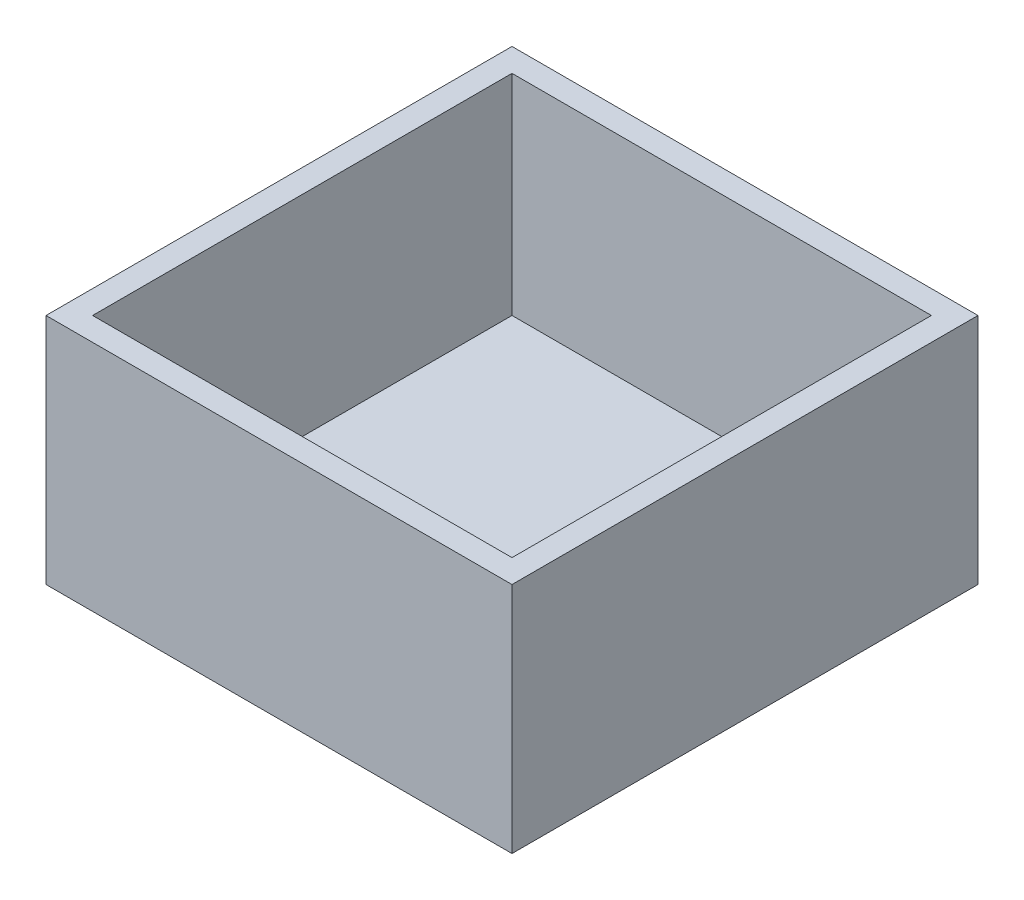
ISO-10303-21;
HEADER;
FILE_DESCRIPTION(('STEP AP214'),'2;1');
FILE_NAME('part.step','',(''),(''),'','','');
FILE_SCHEMA(('AUTOMOTIVE_DESIGN { 1 0 10303 214 1 1 1 1 }'));
ENDSEC;
DATA;
#1=APPLICATION_CONTEXT('core data for automotive mechanical design processes');
#2=APPLICATION_PROTOCOL_DEFINITION('international standard','automotive_design',2000,#1);
#3=PRODUCT_CONTEXT('',#1,'mechanical');
#4=PRODUCT('Part','Part','',(#3));
#5=PRODUCT_RELATED_PRODUCT_CATEGORY('part','',(#4));
#6=PRODUCT_DEFINITION_FORMATION('','',#4);
#7=PRODUCT_DEFINITION_CONTEXT('part definition',#1,'design');
#8=PRODUCT_DEFINITION('design','',#6,#7);
#9=PRODUCT_DEFINITION_SHAPE('','',#8);
#10=(LENGTH_UNIT() NAMED_UNIT(*) SI_UNIT(.MILLI.,.METRE.));
#11=(NAMED_UNIT(*) PLANE_ANGLE_UNIT() SI_UNIT($,.RADIAN.));
#12=(NAMED_UNIT(*) SI_UNIT($,.STERADIAN.) SOLID_ANGLE_UNIT());
#13=UNCERTAINTY_MEASURE_WITH_UNIT(LENGTH_MEASURE(1.E-05),#10,'distance_accuracy_value','');
#14=(GEOMETRIC_REPRESENTATION_CONTEXT(3) GLOBAL_UNCERTAINTY_ASSIGNED_CONTEXT((#13)) GLOBAL_UNIT_ASSIGNED_CONTEXT((#10,
#11,#12)) REPRESENTATION_CONTEXT('',''));
#15=CARTESIAN_POINT('',(0.,0.,0.));
#16=DIRECTION('',(0.,0.,1.));
#17=DIRECTION('',(1.,0.,0.));
#18=AXIS2_PLACEMENT_3D('',#15,#16,#17);
#19=CARTESIAN_POINT('',(50.,50.,-50.));
#20=DIRECTION('',(-1.,0.,0.));
#21=DIRECTION('',(0.,0.,1.));
#22=AXIS2_PLACEMENT_3D('',#19,#20,#21);
#23=PLANE('',#22);
#24=DIRECTION('',(0.,0.,-1.));
#25=VECTOR('',#24,1.);
#26=CARTESIAN_POINT('',(50.,0.,-50.));
#27=LINE('',#26,#25);
#28=CARTESIAN_POINT('',(50.,0.,50.));
#29=VERTEX_POINT('',#28);
#30=CARTESIAN_POINT('',(50.,0.,-50.));
#31=VERTEX_POINT('',#30);
#32=EDGE_CURVE('E151',#29,#31,#27,.T.);
#33=ORIENTED_EDGE('',*,*,#32,.T.);
#34=DIRECTION('',(0.,-1.,0.));
#35=VECTOR('',#34,1.);
#36=CARTESIAN_POINT('',(50.,50.,-50.));
#37=LINE('',#36,#35);
#38=CARTESIAN_POINT('',(50.,50.,-50.));
#39=VERTEX_POINT('',#38);
#40=EDGE_CURVE('E11',#39,#31,#37,.T.);
#41=ORIENTED_EDGE('',*,*,#40,.F.);
#42=DIRECTION('',(0.,0.,-1.));
#43=VECTOR('',#42,1.);
#44=CARTESIAN_POINT('',(50.,50.,-50.));
#45=LINE('',#44,#43);
#46=CARTESIAN_POINT('',(50.,50.,50.));
#47=VERTEX_POINT('',#46);
#48=EDGE_CURVE('E144',#47,#39,#45,.T.);
#49=ORIENTED_EDGE('',*,*,#48,.F.);
#50=DIRECTION('',(0.,-1.,0.));
#51=VECTOR('',#50,1.);
#52=CARTESIAN_POINT('',(50.,50.,50.));
#53=LINE('',#52,#51);
#54=EDGE_CURVE('E150',#47,#29,#53,.T.);
#55=ORIENTED_EDGE('',*,*,#54,.T.);
#56=EDGE_LOOP('',(#33,#41,#49,#55));
#57=FACE_BOUND('',#56,.T.);
#58=ADVANCED_FACE('F37',(#57),#23,.F.);
#59=CARTESIAN_POINT('',(-50.,50.,-50.));
#60=DIRECTION('',(0.,0.,1.));
#61=DIRECTION('',(1.,0.,0.));
#62=AXIS2_PLACEMENT_3D('',#59,#60,#61);
#63=PLANE('',#62);
#64=DIRECTION('',(-1.,0.,0.));
#65=VECTOR('',#64,1.);
#66=CARTESIAN_POINT('',(-50.,0.,-50.));
#67=LINE('',#66,#65);
#68=CARTESIAN_POINT('',(-50.,0.,-50.));
#69=VERTEX_POINT('',#68);
#70=EDGE_CURVE('E154',#31,#69,#67,.T.);
#71=ORIENTED_EDGE('',*,*,#70,.T.);
#72=DIRECTION('',(0.,-1.,0.));
#73=VECTOR('',#72,1.);
#74=CARTESIAN_POINT('',(-50.,50.,-50.));
#75=LINE('',#74,#73);
#76=CARTESIAN_POINT('',(-50.,50.,-50.));
#77=VERTEX_POINT('',#76);
#78=EDGE_CURVE('E44',#77,#69,#75,.T.);
#79=ORIENTED_EDGE('',*,*,#78,.F.);
#80=DIRECTION('',(-1.,0.,0.));
#81=VECTOR('',#80,1.);
#82=CARTESIAN_POINT('',(-50.,50.,-50.));
#83=LINE('',#82,#81);
#84=EDGE_CURVE('E88',#39,#77,#83,.T.);
#85=ORIENTED_EDGE('',*,*,#84,.F.);
#86=ORIENTED_EDGE('',*,*,#40,.T.);
#87=EDGE_LOOP('',(#71,#79,#85,#86));
#88=FACE_BOUND('',#87,.T.);
#89=ADVANCED_FACE('F183',(#88),#63,.F.);
#90=CARTESIAN_POINT('',(-50.,50.,-50.));
#91=DIRECTION('',(1.,0.,0.));
#92=DIRECTION('',(0.,0.,-1.));
#93=AXIS2_PLACEMENT_3D('',#90,#91,#92);
#94=PLANE('',#93);
#95=DIRECTION('',(0.,0.,1.));
#96=VECTOR('',#95,1.);
#97=CARTESIAN_POINT('',(-50.,0.,-50.));
#98=LINE('',#97,#96);
#99=CARTESIAN_POINT('',(-50.,0.,50.));
#100=VERTEX_POINT('',#99);
#101=EDGE_CURVE('E156',#69,#100,#98,.T.);
#102=ORIENTED_EDGE('',*,*,#101,.T.);
#103=DIRECTION('',(0.,-1.,0.));
#104=VECTOR('',#103,1.);
#105=CARTESIAN_POINT('',(-50.,50.,50.));
#106=LINE('',#105,#104);
#107=CARTESIAN_POINT('',(-50.,50.,50.));
#108=VERTEX_POINT('',#107);
#109=EDGE_CURVE('E160',#108,#100,#106,.T.);
#110=ORIENTED_EDGE('',*,*,#109,.F.);
#111=DIRECTION('',(0.,0.,1.));
#112=VECTOR('',#111,1.);
#113=CARTESIAN_POINT('',(-50.,50.,-50.));
#114=LINE('',#113,#112);
#115=EDGE_CURVE('E147',#77,#108,#114,.T.);
#116=ORIENTED_EDGE('',*,*,#115,.F.);
#117=ORIENTED_EDGE('',*,*,#78,.T.);
#118=EDGE_LOOP('',(#102,#110,#116,#117));
#119=FACE_BOUND('',#118,.T.);
#120=ADVANCED_FACE('F165',(#119),#94,.F.);
#121=CARTESIAN_POINT('',(-50.,50.,50.));
#122=DIRECTION('',(0.,0.,-1.));
#123=DIRECTION('',(-1.,0.,0.));
#124=AXIS2_PLACEMENT_3D('',#121,#122,#123);
#125=PLANE('',#124);
#126=DIRECTION('',(1.,0.,0.));
#127=VECTOR('',#126,1.);
#128=CARTESIAN_POINT('',(-50.,0.,50.));
#129=LINE('',#128,#127);
#130=EDGE_CURVE('E81',#100,#29,#129,.T.);
#131=ORIENTED_EDGE('',*,*,#130,.T.);
#132=ORIENTED_EDGE('',*,*,#54,.F.);
#133=DIRECTION('',(1.,0.,0.));
#134=VECTOR('',#133,1.);
#135=CARTESIAN_POINT('',(-50.,50.,50.));
#136=LINE('',#135,#134);
#137=EDGE_CURVE('E60',#108,#47,#136,.T.);
#138=ORIENTED_EDGE('',*,*,#137,.F.);
#139=ORIENTED_EDGE('',*,*,#109,.T.);
#140=EDGE_LOOP('',(#131,#132,#138,#139));
#141=FACE_BOUND('',#140,.T.);
#142=ADVANCED_FACE('F173',(#141),#125,.F.);
#143=CARTESIAN_POINT('',(0.,50.,0.));
#144=DIRECTION('',(0.,1.,0.));
#145=DIRECTION('',(0.,0.,1.));
#146=AXIS2_PLACEMENT_3D('',#143,#144,#145);
#147=PLANE('',#146);
#148=DIRECTION('',(0.,0.,-1.));
#149=VECTOR('',#148,1.);
#150=CARTESIAN_POINT('',(45.,50.,-50.));
#151=LINE('',#150,#149);
#152=CARTESIAN_POINT('',(45.,50.,45.));
#153=VERTEX_POINT('',#152);
#154=CARTESIAN_POINT('',(45.,50.,-45.));
#155=VERTEX_POINT('',#154);
#156=EDGE_CURVE('E133',#153,#155,#151,.T.);
#157=ORIENTED_EDGE('',*,*,#156,.F.);
#158=DIRECTION('',(1.,0.,0.));
#159=VECTOR('',#158,1.);
#160=CARTESIAN_POINT('',(-50.,50.,45.));
#161=LINE('',#160,#159);
#162=CARTESIAN_POINT('',(-45.,50.,45.));
#163=VERTEX_POINT('',#162);
#164=EDGE_CURVE('E142',#163,#153,#161,.T.);
#165=ORIENTED_EDGE('',*,*,#164,.F.);
#166=DIRECTION('',(0.,0.,1.));
#167=VECTOR('',#166,1.);
#168=CARTESIAN_POINT('',(-45.,50.,-50.));
#169=LINE('',#168,#167);
#170=CARTESIAN_POINT('',(-45.,50.,-45.));
#171=VERTEX_POINT('',#170);
#172=EDGE_CURVE('E140',#171,#163,#169,.T.);
#173=ORIENTED_EDGE('',*,*,#172,.F.);
#174=DIRECTION('',(-1.,0.,0.));
#175=VECTOR('',#174,1.);
#176=CARTESIAN_POINT('',(-50.,50.,-45.));
#177=LINE('',#176,#175);
#178=EDGE_CURVE('E125',#155,#171,#177,.T.);
#179=ORIENTED_EDGE('',*,*,#178,.F.);
#180=EDGE_LOOP('',(#157,#165,#173,#179));
#181=FACE_BOUND('',#180,.T.);
#182=ORIENTED_EDGE('',*,*,#48,.T.);
#183=ORIENTED_EDGE('',*,*,#84,.T.);
#184=ORIENTED_EDGE('',*,*,#115,.T.);
#185=ORIENTED_EDGE('',*,*,#137,.T.);
#186=EDGE_LOOP('',(#182,#183,#184,#185));
#187=FACE_BOUND('',#186,.T.);
#188=ADVANCED_FACE('F175',(#181,#187),#147,.T.);
#189=CARTESIAN_POINT('',(0.,0.,0.));
#190=DIRECTION('',(0.,1.,0.));
#191=DIRECTION('',(0.,0.,1.));
#192=AXIS2_PLACEMENT_3D('',#189,#190,#191);
#193=PLANE('',#192);
#194=ORIENTED_EDGE('',*,*,#32,.F.);
#195=ORIENTED_EDGE('',*,*,#130,.F.);
#196=ORIENTED_EDGE('',*,*,#101,.F.);
#197=ORIENTED_EDGE('',*,*,#70,.F.);
#198=EDGE_LOOP('',(#194,#195,#196,#197));
#199=FACE_BOUND('',#198,.T.);
#200=ADVANCED_FACE('F169',(#199),#193,.F.);
#201=CARTESIAN_POINT('',(45.,50.,-50.));
#202=DIRECTION('',(-1.,0.,0.));
#203=DIRECTION('',(0.,0.,1.));
#204=AXIS2_PLACEMENT_3D('',#201,#202,#203);
#205=PLANE('',#204);
#206=DIRECTION('',(0.,0.,-1.));
#207=VECTOR('',#206,1.);
#208=CARTESIAN_POINT('',(45.,5.,-50.));
#209=LINE('',#208,#207);
#210=CARTESIAN_POINT('',(45.,5.,45.));
#211=VERTEX_POINT('',#210);
#212=CARTESIAN_POINT('',(45.,5.,-45.));
#213=VERTEX_POINT('',#212);
#214=EDGE_CURVE('E116',#211,#213,#209,.T.);
#215=ORIENTED_EDGE('',*,*,#214,.F.);
#216=DIRECTION('',(0.,-1.,0.));
#217=VECTOR('',#216,1.);
#218=CARTESIAN_POINT('',(45.,50.,45.));
#219=LINE('',#218,#217);
#220=EDGE_CURVE('E136',#153,#211,#219,.T.);
#221=ORIENTED_EDGE('',*,*,#220,.F.);
#222=ORIENTED_EDGE('',*,*,#156,.T.);
#223=DIRECTION('',(0.,-1.,0.));
#224=VECTOR('',#223,1.);
#225=CARTESIAN_POINT('',(45.,50.,-45.));
#226=LINE('',#225,#224);
#227=EDGE_CURVE('E128',#155,#213,#226,.T.);
#228=ORIENTED_EDGE('',*,*,#227,.T.);
#229=EDGE_LOOP('',(#215,#221,#222,#228));
#230=FACE_BOUND('',#229,.T.);
#231=ADVANCED_FACE('F210',(#230),#205,.T.);
#232=CARTESIAN_POINT('',(-50.,50.,-45.));
#233=DIRECTION('',(0.,0.,1.));
#234=DIRECTION('',(1.,0.,0.));
#235=AXIS2_PLACEMENT_3D('',#232,#233,#234);
#236=PLANE('',#235);
#237=DIRECTION('',(-1.,0.,0.));
#238=VECTOR('',#237,1.);
#239=CARTESIAN_POINT('',(-50.,5.,-45.));
#240=LINE('',#239,#238);
#241=CARTESIAN_POINT('',(-45.,5.,-45.));
#242=VERTEX_POINT('',#241);
#243=EDGE_CURVE('E110',#213,#242,#240,.T.);
#244=ORIENTED_EDGE('',*,*,#243,.F.);
#245=ORIENTED_EDGE('',*,*,#227,.F.);
#246=ORIENTED_EDGE('',*,*,#178,.T.);
#247=DIRECTION('',(0.,-1.,0.));
#248=VECTOR('',#247,1.);
#249=CARTESIAN_POINT('',(-45.,50.,-45.));
#250=LINE('',#249,#248);
#251=EDGE_CURVE('E122',#171,#242,#250,.T.);
#252=ORIENTED_EDGE('',*,*,#251,.T.);
#253=EDGE_LOOP('',(#244,#245,#246,#252));
#254=FACE_BOUND('',#253,.T.);
#255=ADVANCED_FACE('F123',(#254),#236,.T.);
#256=CARTESIAN_POINT('',(-45.,50.,-50.));
#257=DIRECTION('',(1.,0.,0.));
#258=DIRECTION('',(0.,0.,-1.));
#259=AXIS2_PLACEMENT_3D('',#256,#257,#258);
#260=PLANE('',#259);
#261=DIRECTION('',(0.,0.,1.));
#262=VECTOR('',#261,1.);
#263=CARTESIAN_POINT('',(-45.,5.,-50.));
#264=LINE('',#263,#262);
#265=CARTESIAN_POINT('',(-45.,5.,45.));
#266=VERTEX_POINT('',#265);
#267=EDGE_CURVE('E114',#242,#266,#264,.T.);
#268=ORIENTED_EDGE('',*,*,#267,.F.);
#269=ORIENTED_EDGE('',*,*,#251,.F.);
#270=ORIENTED_EDGE('',*,*,#172,.T.);
#271=DIRECTION('',(0.,-1.,0.));
#272=VECTOR('',#271,1.);
#273=CARTESIAN_POINT('',(-45.,50.,45.));
#274=LINE('',#273,#272);
#275=EDGE_CURVE('E51',#163,#266,#274,.T.);
#276=ORIENTED_EDGE('',*,*,#275,.T.);
#277=EDGE_LOOP('',(#268,#269,#270,#276));
#278=FACE_BOUND('',#277,.T.);
#279=ADVANCED_FACE('F130',(#278),#260,.T.);
#280=CARTESIAN_POINT('',(-50.,50.,45.));
#281=DIRECTION('',(0.,0.,-1.));
#282=DIRECTION('',(-1.,0.,0.));
#283=AXIS2_PLACEMENT_3D('',#280,#281,#282);
#284=PLANE('',#283);
#285=DIRECTION('',(1.,0.,0.));
#286=VECTOR('',#285,1.);
#287=CARTESIAN_POINT('',(-50.,5.,45.));
#288=LINE('',#287,#286);
#289=EDGE_CURVE('E131',#266,#211,#288,.T.);
#290=ORIENTED_EDGE('',*,*,#289,.F.);
#291=ORIENTED_EDGE('',*,*,#275,.F.);
#292=ORIENTED_EDGE('',*,*,#164,.T.);
#293=ORIENTED_EDGE('',*,*,#220,.T.);
#294=EDGE_LOOP('',(#290,#291,#292,#293));
#295=FACE_BOUND('',#294,.T.);
#296=ADVANCED_FACE('F240',(#295),#284,.T.);
#297=CARTESIAN_POINT('',(0.,5.,0.));
#298=DIRECTION('',(0.,1.,0.));
#299=DIRECTION('',(0.,0.,1.));
#300=AXIS2_PLACEMENT_3D('',#297,#298,#299);
#301=PLANE('',#300);
#302=ORIENTED_EDGE('',*,*,#214,.T.);
#303=ORIENTED_EDGE('',*,*,#243,.T.);
#304=ORIENTED_EDGE('',*,*,#267,.T.);
#305=ORIENTED_EDGE('',*,*,#289,.T.);
#306=EDGE_LOOP('',(#302,#303,#304,#305));
#307=FACE_BOUND('',#306,.T.);
#308=ADVANCED_FACE('F112',(#307),#301,.T.);
#309=CLOSED_SHELL('',(#58,#89,#120,#142,#188,#200,#231,#255,#279,#296,#308));
#310=MANIFOLD_SOLID_BREP('B2',#309);
#311=ADVANCED_BREP_SHAPE_REPRESENTATION('',(#18,#310),#14);
#312=SHAPE_DEFINITION_REPRESENTATION(#9,#311);
ENDSEC;
END-ISO-10303-21;
